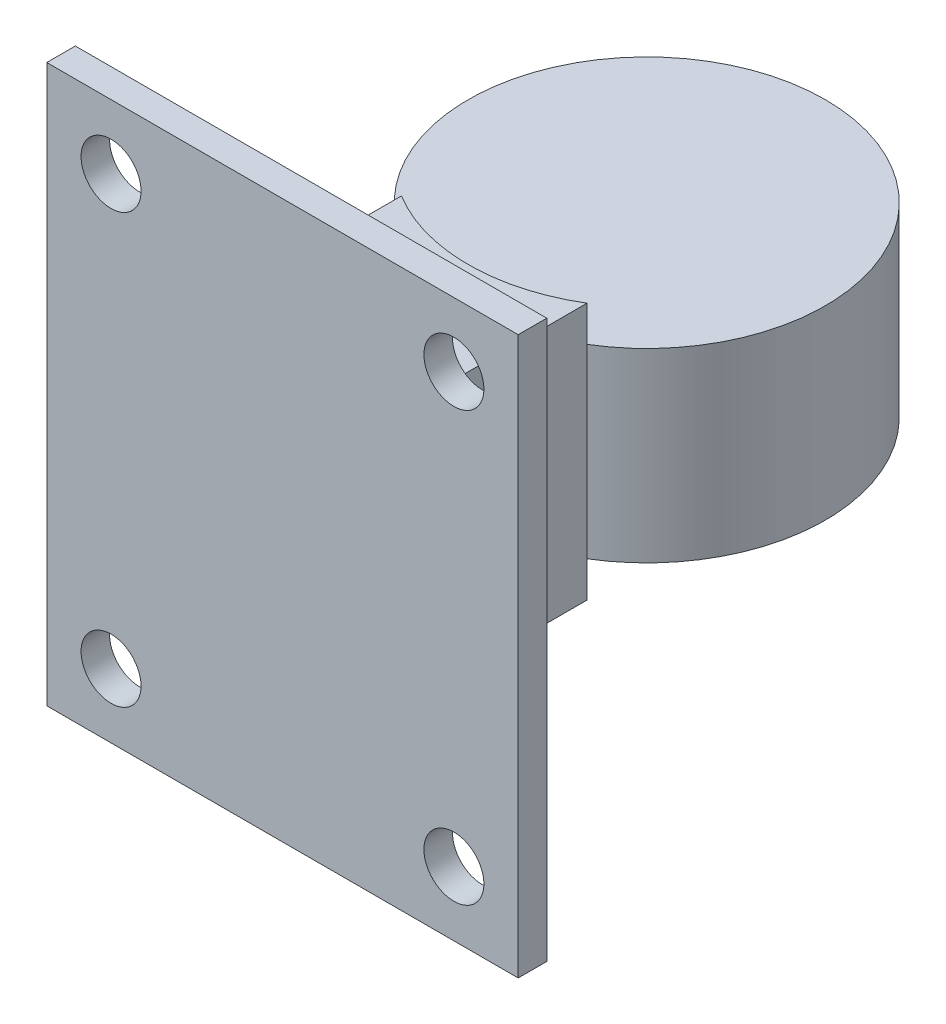
ISO-10303-21;
HEADER;
FILE_DESCRIPTION(('STEP AP214'),'2;1');
FILE_NAME('part.step','',(''),(''),'','','');
FILE_SCHEMA(('AUTOMOTIVE_DESIGN { 1 0 10303 214 1 1 1 1 }'));
ENDSEC;
DATA;
#1=APPLICATION_CONTEXT('core data for automotive mechanical design processes');
#2=APPLICATION_PROTOCOL_DEFINITION('international standard','automotive_design',2000,#1);
#3=PRODUCT_CONTEXT('',#1,'mechanical');
#4=PRODUCT('Part','Part','',(#3));
#5=PRODUCT_RELATED_PRODUCT_CATEGORY('part','',(#4));
#6=PRODUCT_DEFINITION_FORMATION('','',#4);
#7=PRODUCT_DEFINITION_CONTEXT('part definition',#1,'design');
#8=PRODUCT_DEFINITION('design','',#6,#7);
#9=PRODUCT_DEFINITION_SHAPE('','',#8);
#10=(LENGTH_UNIT() NAMED_UNIT(*) SI_UNIT(.MILLI.,.METRE.));
#11=(NAMED_UNIT(*) PLANE_ANGLE_UNIT() SI_UNIT($,.RADIAN.));
#12=(NAMED_UNIT(*) SI_UNIT($,.STERADIAN.) SOLID_ANGLE_UNIT());
#13=UNCERTAINTY_MEASURE_WITH_UNIT(LENGTH_MEASURE(1.E-05),#10,'distance_accuracy_value','');
#14=(GEOMETRIC_REPRESENTATION_CONTEXT(3) GLOBAL_UNCERTAINTY_ASSIGNED_CONTEXT((#13)) GLOBAL_UNIT_ASSIGNED_CONTEXT((#10,
#11,#12)) REPRESENTATION_CONTEXT('',''));
#15=CARTESIAN_POINT('',(0.,0.,0.));
#16=DIRECTION('',(0.,0.,1.));
#17=DIRECTION('',(1.,0.,0.));
#18=AXIS2_PLACEMENT_3D('',#15,#16,#17);
#19=CARTESIAN_POINT('',(16.5,6.5,12.5));
#20=DIRECTION('',(0.,1.,0.));
#21=DIRECTION('',(1.,0.,0.));
#22=AXIS2_PLACEMENT_3D('',#19,#20,#21);
#23=PLANE('',#22);
#24=CARTESIAN_POINT('',(16.5,6.5,12.5));
#25=DIRECTION('',(0.,1.,0.));
#26=DIRECTION('',(1.,0.,0.));
#27=AXIS2_PLACEMENT_3D('',#24,#25,#26);
#28=CIRCLE('',#27,12.5);
#29=CARTESIAN_POINT('',(22.9999998509884,6.5,23.1770783427467));
#30=VERTEX_POINT('',#29);
#31=CARTESIAN_POINT('',(10.0000001490116,6.5,23.1770783427467));
#32=VERTEX_POINT('',#31);
#33=EDGE_CURVE('P0_E11',#30,#32,#28,.T.);
#34=ORIENTED_EDGE('',*,*,#33,.T.);
#35=CARTESIAN_POINT('',(16.5,6.5,12.5));
#36=DIRECTION('',(0.,1.,0.));
#37=DIRECTION('',(1.,0.,0.));
#38=AXIS2_PLACEMENT_3D('',#35,#36,#37);
#39=CIRCLE('',#38,12.5);
#40=EDGE_CURVE('P0_E131',#32,#30,#39,.T.);
#41=ORIENTED_EDGE('',*,*,#40,.T.);
#42=EDGE_LOOP('',(#34,#41));
#43=FACE_BOUND('',#42,.T.);
#44=ADVANCED_FACE('P0_F17',(#43),#23,.T.);
#45=CARTESIAN_POINT('',(16.5,-6.5,12.5));
#46=DIRECTION('',(0.,1.,0.));
#47=DIRECTION('',(1.,0.,0.));
#48=AXIS2_PLACEMENT_3D('',#45,#46,#47);
#49=PLANE('',#48);
#50=CARTESIAN_POINT('',(16.5,-6.5,12.5));
#51=DIRECTION('',(0.,-1.,0.));
#52=DIRECTION('',(1.,0.,0.));
#53=AXIS2_PLACEMENT_3D('',#50,#51,#52);
#54=CIRCLE('',#53,12.5);
#55=CARTESIAN_POINT('',(10.0000001490116,-6.5,23.1770783427467));
#56=VERTEX_POINT('',#55);
#57=CARTESIAN_POINT('',(22.9999998509884,-6.5,23.1770783427467));
#58=VERTEX_POINT('',#57);
#59=EDGE_CURVE('P0_E25',#56,#58,#54,.T.);
#60=ORIENTED_EDGE('',*,*,#59,.T.);
#61=CARTESIAN_POINT('',(16.5,-6.5,12.5));
#62=DIRECTION('',(0.,-1.,0.));
#63=DIRECTION('',(1.,0.,0.));
#64=AXIS2_PLACEMENT_3D('',#61,#62,#63);
#65=CIRCLE('',#64,12.5);
#66=EDGE_CURVE('P0_E94',#58,#56,#65,.T.);
#67=ORIENTED_EDGE('',*,*,#66,.T.);
#68=EDGE_LOOP('',(#60,#67));
#69=FACE_BOUND('',#68,.T.);
#70=ADVANCED_FACE('P0_F92',(#69),#49,.F.);
#71=CARTESIAN_POINT('',(16.5,0.,12.5));
#72=DIRECTION('',(0.,1.,0.));
#73=DIRECTION('',(0.,0.,-1.));
#74=AXIS2_PLACEMENT_3D('',#71,#72,#73);
#75=CYLINDRICAL_SURFACE('',#74,12.5);
#76=DIRECTION('',(0.,-1.,0.));
#77=VECTOR('',#76,1.);
#78=CARTESIAN_POINT('',(22.9999998509884,0.,23.1770783427467));
#79=LINE('',#78,#77);
#80=EDGE_CURVE('P0_E100',#30,#58,#79,.T.);
#81=ORIENTED_EDGE('',*,*,#80,.T.);
#82=ORIENTED_EDGE('',*,*,#59,.F.);
#83=DIRECTION('',(0.,1.,0.));
#84=VECTOR('',#83,1.);
#85=CARTESIAN_POINT('',(10.0000001490116,0.,23.1770783427467));
#86=LINE('',#85,#84);
#87=EDGE_CURVE('P0_E105',#56,#32,#86,.T.);
#88=ORIENTED_EDGE('',*,*,#87,.T.);
#89=ORIENTED_EDGE('',*,*,#33,.F.);
#90=EDGE_LOOP('',(#81,#82,#88,#89));
#91=FACE_BOUND('',#90,.T.);
#92=ADVANCED_FACE('P0_F102',(#91),#75,.T.);
#93=CARTESIAN_POINT('',(16.5,9.,29.5885394395943));
#94=DIRECTION('',(0.,1.,0.));
#95=DIRECTION('',(1.,0.,0.));
#96=AXIS2_PLACEMENT_3D('',#93,#94,#95);
#97=PLANE('',#96);
#98=DIRECTION('',(1.,0.,0.));
#99=VECTOR('',#98,1.);
#100=CARTESIAN_POINT('',(0.,9.,36.0000005364418));
#101=LINE('',#100,#99);
#102=CARTESIAN_POINT('',(10.0000001490116,9.,36.0000005364418));
#103=VERTEX_POINT('',#102);
#104=CARTESIAN_POINT('',(22.9999998509884,9.,36.0000005364418));
#105=VERTEX_POINT('',#104);
#106=EDGE_CURVE('P0_E37',#103,#105,#101,.T.);
#107=ORIENTED_EDGE('',*,*,#106,.T.);
#108=DIRECTION('',(0.,0.,-1.));
#109=VECTOR('',#108,1.);
#110=CARTESIAN_POINT('',(22.9999998509884,9.,23.1770783427467));
#111=LINE('',#110,#109);
#112=CARTESIAN_POINT('',(22.9999998509884,9.,23.1770783427467));
#113=VERTEX_POINT('',#112);
#114=EDGE_CURVE('P0_E67',#105,#113,#111,.T.);
#115=ORIENTED_EDGE('',*,*,#114,.T.);
#116=CARTESIAN_POINT('',(16.5,9.,12.5));
#117=DIRECTION('',(0.,-1.,0.));
#118=DIRECTION('',(1.,0.,0.));
#119=AXIS2_PLACEMENT_3D('',#116,#117,#118);
#120=CIRCLE('',#119,12.5);
#121=CARTESIAN_POINT('',(10.0000001490116,9.,23.1770783427467));
#122=VERTEX_POINT('',#121);
#123=EDGE_CURVE('P0_E151',#113,#122,#120,.T.);
#124=ORIENTED_EDGE('',*,*,#123,.T.);
#125=DIRECTION('',(0.,0.,1.));
#126=VECTOR('',#125,1.);
#127=CARTESIAN_POINT('',(10.0000001490116,9.,36.0000005364418));
#128=LINE('',#127,#126);
#129=EDGE_CURVE('P0_E134',#122,#103,#128,.T.);
#130=ORIENTED_EDGE('',*,*,#129,.T.);
#131=EDGE_LOOP('',(#107,#115,#124,#130));
#132=FACE_BOUND('',#131,.T.);
#133=ADVANCED_FACE('P0_F209',(#132),#97,.T.);
#134=CARTESIAN_POINT('',(10.0000001490116,0.,36.0000005364418));
#135=DIRECTION('',(0.,0.,1.));
#136=DIRECTION('',(1.,0.,0.));
#137=AXIS2_PLACEMENT_3D('',#134,#135,#136);
#138=PLANE('',#137);
#139=DIRECTION('',(0.,1.,0.));
#140=VECTOR('',#139,1.);
#141=CARTESIAN_POINT('',(22.9999998509884,0.,36.0000005364418));
#142=LINE('',#141,#140);
#143=CARTESIAN_POINT('',(22.9999998509884,-9.,36.0000005364418));
#144=VERTEX_POINT('',#143);
#145=EDGE_CURVE('P0_E75',#144,#105,#142,.T.);
#146=ORIENTED_EDGE('',*,*,#145,.T.);
#147=ORIENTED_EDGE('',*,*,#106,.F.);
#148=DIRECTION('',(0.,-1.,0.));
#149=VECTOR('',#148,1.);
#150=CARTESIAN_POINT('',(10.0000001490116,0.,36.0000005364418));
#151=LINE('',#150,#149);
#152=CARTESIAN_POINT('',(10.0000001490116,-9.,36.0000005364418));
#153=VERTEX_POINT('',#152);
#154=EDGE_CURVE('P0_E159',#103,#153,#151,.T.);
#155=ORIENTED_EDGE('',*,*,#154,.T.);
#156=DIRECTION('',(-1.,0.,0.));
#157=VECTOR('',#156,1.);
#158=CARTESIAN_POINT('',(0.,-9.,36.0000005364418));
#159=LINE('',#158,#157);
#160=EDGE_CURVE('P0_E139',#144,#153,#159,.T.);
#161=ORIENTED_EDGE('',*,*,#160,.F.);
#162=EDGE_LOOP('',(#146,#147,#155,#161));
#163=FACE_BOUND('',#162,.T.);
#164=ADVANCED_FACE('P0_F214',(#163),#138,.T.);
#165=CARTESIAN_POINT('',(22.9999998509884,0.,36.0000005364418));
#166=DIRECTION('',(1.,0.,0.));
#167=DIRECTION('',(0.,1.,0.));
#168=AXIS2_PLACEMENT_3D('',#165,#166,#167);
#169=PLANE('',#168);
#170=DIRECTION('',(0.,1.,0.));
#171=VECTOR('',#170,1.);
#172=CARTESIAN_POINT('',(22.9999998509884,0.,23.1770783427467));
#173=LINE('',#172,#171);
#174=CARTESIAN_POINT('',(22.9999998509884,-9.,23.1770783427467));
#175=VERTEX_POINT('',#174);
#176=EDGE_CURVE('P0_E108',#175,#58,#173,.T.);
#177=ORIENTED_EDGE('',*,*,#176,.T.);
#178=ORIENTED_EDGE('',*,*,#80,.F.);
#179=DIRECTION('',(0.,1.,0.));
#180=VECTOR('',#179,1.);
#181=CARTESIAN_POINT('',(22.9999998509884,0.,23.1770783427467));
#182=LINE('',#181,#180);
#183=EDGE_CURVE('P0_E143',#30,#113,#182,.T.);
#184=ORIENTED_EDGE('',*,*,#183,.T.);
#185=ORIENTED_EDGE('',*,*,#114,.F.);
#186=ORIENTED_EDGE('',*,*,#145,.F.);
#187=DIRECTION('',(0.,0.,1.));
#188=VECTOR('',#187,1.);
#189=CARTESIAN_POINT('',(22.9999998509884,-9.,23.1770783427467));
#190=LINE('',#189,#188);
#191=EDGE_CURVE('P0_E110',#175,#144,#190,.T.);
#192=ORIENTED_EDGE('',*,*,#191,.F.);
#193=EDGE_LOOP('',(#177,#178,#184,#185,#186,#192));
#194=FACE_BOUND('',#193,.T.);
#195=ADVANCED_FACE('P0_F109',(#194),#169,.T.);
#196=CARTESIAN_POINT('',(10.0000001490116,0.,23.1770783427467));
#197=DIRECTION('',(-1.,0.,0.));
#198=DIRECTION('',(0.,0.,1.));
#199=AXIS2_PLACEMENT_3D('',#196,#197,#198);
#200=PLANE('',#199);
#201=ORIENTED_EDGE('',*,*,#154,.F.);
#202=ORIENTED_EDGE('',*,*,#129,.F.);
#203=DIRECTION('',(0.,1.,0.));
#204=VECTOR('',#203,1.);
#205=CARTESIAN_POINT('',(10.0000001490116,0.,23.1770783427467));
#206=LINE('',#205,#204);
#207=EDGE_CURVE('P0_E146',#32,#122,#206,.T.);
#208=ORIENTED_EDGE('',*,*,#207,.F.);
#209=ORIENTED_EDGE('',*,*,#87,.F.);
#210=DIRECTION('',(0.,1.,0.));
#211=VECTOR('',#210,1.);
#212=CARTESIAN_POINT('',(10.0000001490116,0.,23.1770783427467));
#213=LINE('',#212,#211);
#214=CARTESIAN_POINT('',(10.0000001490116,-9.,23.1770783427467));
#215=VERTEX_POINT('',#214);
#216=EDGE_CURVE('P0_E120',#215,#56,#213,.T.);
#217=ORIENTED_EDGE('',*,*,#216,.F.);
#218=DIRECTION('',(0.,0.,-1.));
#219=VECTOR('',#218,1.);
#220=CARTESIAN_POINT('',(10.0000001490116,-9.,36.0000005364418));
#221=LINE('',#220,#219);
#222=EDGE_CURVE('P0_E135',#153,#215,#221,.T.);
#223=ORIENTED_EDGE('',*,*,#222,.F.);
#224=EDGE_LOOP('',(#201,#202,#208,#209,#217,#223));
#225=FACE_BOUND('',#224,.T.);
#226=ADVANCED_FACE('P0_F231',(#225),#200,.T.);
#227=CARTESIAN_POINT('',(16.5,-9.,29.5885394395943));
#228=DIRECTION('',(0.,1.,0.));
#229=DIRECTION('',(1.,0.,0.));
#230=AXIS2_PLACEMENT_3D('',#227,#228,#229);
#231=PLANE('',#230);
#232=ORIENTED_EDGE('',*,*,#160,.T.);
#233=ORIENTED_EDGE('',*,*,#222,.T.);
#234=CARTESIAN_POINT('',(16.5,-9.,12.5));
#235=DIRECTION('',(0.,1.,0.));
#236=DIRECTION('',(1.,0.,0.));
#237=AXIS2_PLACEMENT_3D('',#234,#235,#236);
#238=CIRCLE('',#237,12.5);
#239=EDGE_CURVE('P0_E115',#215,#175,#238,.T.);
#240=ORIENTED_EDGE('',*,*,#239,.T.);
#241=ORIENTED_EDGE('',*,*,#191,.T.);
#242=EDGE_LOOP('',(#232,#233,#240,#241));
#243=FACE_BOUND('',#242,.T.);
#244=ADVANCED_FACE('P0_F239',(#243),#231,.F.);
#245=CARTESIAN_POINT('',(16.5,0.,12.5));
#246=DIRECTION('',(0.,1.,0.));
#247=DIRECTION('',(1.,0.,0.));
#248=AXIS2_PLACEMENT_3D('',#245,#246,#247);
#249=CYLINDRICAL_SURFACE('',#248,12.5);
#250=ORIENTED_EDGE('',*,*,#40,.F.);
#251=ORIENTED_EDGE('',*,*,#207,.T.);
#252=ORIENTED_EDGE('',*,*,#123,.F.);
#253=ORIENTED_EDGE('',*,*,#183,.F.);
#254=EDGE_LOOP('',(#250,#251,#252,#253));
#255=FACE_BOUND('',#254,.T.);
#256=ADVANCED_FACE('P0_F223',(#255),#249,.F.);
#257=CARTESIAN_POINT('',(16.5,0.,12.5));
#258=DIRECTION('',(0.,1.,0.));
#259=DIRECTION('',(1.,0.,0.));
#260=AXIS2_PLACEMENT_3D('',#257,#258,#259);
#261=CYLINDRICAL_SURFACE('',#260,12.5);
#262=ORIENTED_EDGE('',*,*,#66,.F.);
#263=ORIENTED_EDGE('',*,*,#176,.F.);
#264=ORIENTED_EDGE('',*,*,#239,.F.);
#265=ORIENTED_EDGE('',*,*,#216,.T.);
#266=EDGE_LOOP('',(#262,#263,#264,#265));
#267=FACE_BOUND('',#266,.T.);
#268=ADVANCED_FACE('P0_F118',(#267),#261,.F.);
#269=CLOSED_SHELL('',(#44,#70,#92,#133,#164,#195,#226,#244,#256,#268));
#270=MANIFOLD_SOLID_BREP('P0_B1',#269);
#271=CARTESIAN_POINT('',(16.5000002458692,19.5,37.000000551343));
#272=DIRECTION('',(0.,1.,0.));
#273=DIRECTION('',(1.,0.,0.));
#274=AXIS2_PLACEMENT_3D('',#271,#272,#273);
#275=PLANE('',#274);
#276=DIRECTION('',(1.,0.,0.));
#277=VECTOR('',#276,1.);
#278=CARTESIAN_POINT('',(0.,19.5,38.0000005662441));
#279=LINE('',#278,#277);
#280=CARTESIAN_POINT('',(0.,19.5,38.0000005662441));
#281=VERTEX_POINT('',#280);
#282=CARTESIAN_POINT('',(33.,19.5,38.0000005662441));
#283=VERTEX_POINT('',#282);
#284=EDGE_CURVE('P1_E11',#281,#283,#279,.T.);
#285=ORIENTED_EDGE('',*,*,#284,.T.);
#286=DIRECTION('',(0.,0.,-1.));
#287=VECTOR('',#286,1.);
#288=CARTESIAN_POINT('',(33.,19.5,38.0000005662441));
#289=LINE('',#288,#287);
#290=CARTESIAN_POINT('',(33.0000004917383,19.5,36.0000005364418));
#291=VERTEX_POINT('',#290);
#292=EDGE_CURVE('P1_E43',#283,#291,#289,.T.);
#293=ORIENTED_EDGE('',*,*,#292,.T.);
#294=DIRECTION('',(-1.,0.,0.));
#295=VECTOR('',#294,1.);
#296=CARTESIAN_POINT('',(0.,19.5,36.0000005364418));
#297=LINE('',#296,#295);
#298=CARTESIAN_POINT('',(0.,19.5,36.0000005364418));
#299=VERTEX_POINT('',#298);
#300=EDGE_CURVE('P1_E166',#291,#299,#297,.T.);
#301=ORIENTED_EDGE('',*,*,#300,.T.);
#302=DIRECTION('',(0.,0.,1.));
#303=VECTOR('',#302,1.);
#304=CARTESIAN_POINT('',(0.,19.5,0.));
#305=LINE('',#304,#303);
#306=EDGE_CURVE('P1_E160',#299,#281,#305,.T.);
#307=ORIENTED_EDGE('',*,*,#306,.T.);
#308=EDGE_LOOP('',(#285,#293,#301,#307));
#309=FACE_BOUND('',#308,.T.);
#310=ADVANCED_FACE('P1_F17',(#309),#275,.T.);
#311=CARTESIAN_POINT('',(0.,0.,38.0000005662441));
#312=DIRECTION('',(0.,0.,1.));
#313=DIRECTION('',(1.,0.,0.));
#314=AXIS2_PLACEMENT_3D('',#311,#312,#313);
#315=PLANE('',#314);
#316=CARTESIAN_POINT('',(4.5,-15.,38.0000005662441));
#317=DIRECTION('',(0.,0.,-1.));
#318=DIRECTION('',(-1.,0.,0.));
#319=AXIS2_PLACEMENT_3D('',#316,#317,#318);
#320=CIRCLE('',#319,2.1);
#321=CARTESIAN_POINT('',(6.6,-15.,38.0000005662441));
#322=VERTEX_POINT('',#321);
#323=EDGE_CURVE('P1_E146',#322,#322,#320,.T.);
#324=ORIENTED_EDGE('',*,*,#323,.T.);
#325=EDGE_LOOP('',(#324));
#326=FACE_BOUND('',#325,.T.);
#327=CARTESIAN_POINT('',(4.5,15.,38.0000005662441));
#328=DIRECTION('',(0.,0.,-1.));
#329=DIRECTION('',(-1.,0.,0.));
#330=AXIS2_PLACEMENT_3D('',#327,#328,#329);
#331=CIRCLE('',#330,2.1);
#332=CARTESIAN_POINT('',(6.6,15.,38.0000005662441));
#333=VERTEX_POINT('',#332);
#334=EDGE_CURVE('P1_E129',#333,#333,#331,.T.);
#335=ORIENTED_EDGE('',*,*,#334,.T.);
#336=EDGE_LOOP('',(#335));
#337=FACE_BOUND('',#336,.T.);
#338=CARTESIAN_POINT('',(28.5,-15.,38.0000005662441));
#339=DIRECTION('',(0.,0.,-1.));
#340=DIRECTION('',(-1.,0.,0.));
#341=AXIS2_PLACEMENT_3D('',#338,#339,#340);
#342=CIRCLE('',#341,2.1);
#343=CARTESIAN_POINT('',(30.6,-15.,38.0000005662441));
#344=VERTEX_POINT('',#343);
#345=EDGE_CURVE('P1_E107',#344,#344,#342,.T.);
#346=ORIENTED_EDGE('',*,*,#345,.T.);
#347=EDGE_LOOP('',(#346));
#348=FACE_BOUND('',#347,.T.);
#349=CARTESIAN_POINT('',(28.5,15.,38.0000005662441));
#350=DIRECTION('',(0.,0.,-1.));
#351=DIRECTION('',(-1.,0.,0.));
#352=AXIS2_PLACEMENT_3D('',#349,#350,#351);
#353=CIRCLE('',#352,2.1);
#354=CARTESIAN_POINT('',(30.6,15.,38.0000005662441));
#355=VERTEX_POINT('',#354);
#356=EDGE_CURVE('P1_E119',#355,#355,#353,.T.);
#357=ORIENTED_EDGE('',*,*,#356,.T.);
#358=EDGE_LOOP('',(#357));
#359=FACE_BOUND('',#358,.T.);
#360=DIRECTION('',(0.,1.,0.));
#361=VECTOR('',#360,1.);
#362=CARTESIAN_POINT('',(33.,0.,38.0000005662441));
#363=LINE('',#362,#361);
#364=CARTESIAN_POINT('',(33.,-19.5,38.0000005662441));
#365=VERTEX_POINT('',#364);
#366=EDGE_CURVE('P1_E26',#365,#283,#363,.T.);
#367=ORIENTED_EDGE('',*,*,#366,.T.);
#368=ORIENTED_EDGE('',*,*,#284,.F.);
#369=DIRECTION('',(0.,-1.,0.));
#370=VECTOR('',#369,1.);
#371=CARTESIAN_POINT('',(0.,0.,38.0000005662441));
#372=LINE('',#371,#370);
#373=CARTESIAN_POINT('',(0.,-19.5,38.0000005662441));
#374=VERTEX_POINT('',#373);
#375=EDGE_CURVE('P1_E157',#281,#374,#372,.T.);
#376=ORIENTED_EDGE('',*,*,#375,.T.);
#377=DIRECTION('',(-1.,0.,0.));
#378=VECTOR('',#377,1.);
#379=CARTESIAN_POINT('',(0.,-19.5,38.0000005662441));
#380=LINE('',#379,#378);
#381=EDGE_CURVE('P1_E133',#365,#374,#380,.T.);
#382=ORIENTED_EDGE('',*,*,#381,.F.);
#383=EDGE_LOOP('',(#367,#368,#376,#382));
#384=FACE_BOUND('',#383,.T.);
#385=ADVANCED_FACE('P1_F19',(#326,#337,#348,#359,#384),#315,.T.);
#386=CARTESIAN_POINT('',(33.,0.,38.0000005662441));
#387=DIRECTION('',(1.,0.,0.));
#388=DIRECTION('',(0.,1.,0.));
#389=AXIS2_PLACEMENT_3D('',#386,#387,#388);
#390=PLANE('',#389);
#391=DIRECTION('',(0.,1.,0.));
#392=VECTOR('',#391,1.);
#393=CARTESIAN_POINT('',(33.0000004917383,0.,36.0000005364418));
#394=LINE('',#393,#392);
#395=CARTESIAN_POINT('',(33.0000004917383,-19.5,36.0000005364418));
#396=VERTEX_POINT('',#395);
#397=EDGE_CURVE('P1_E168',#396,#291,#394,.T.);
#398=ORIENTED_EDGE('',*,*,#397,.T.);
#399=ORIENTED_EDGE('',*,*,#292,.F.);
#400=ORIENTED_EDGE('',*,*,#366,.F.);
#401=DIRECTION('',(0.,0.,1.));
#402=VECTOR('',#401,1.);
#403=CARTESIAN_POINT('',(33.,-19.5,38.0000005662441));
#404=LINE('',#403,#402);
#405=EDGE_CURVE('P1_E153',#396,#365,#404,.T.);
#406=ORIENTED_EDGE('',*,*,#405,.F.);
#407=EDGE_LOOP('',(#398,#399,#400,#406));
#408=FACE_BOUND('',#407,.T.);
#409=ADVANCED_FACE('P1_F244',(#408),#390,.T.);
#410=CARTESIAN_POINT('',(33.0000004917383,0.,36.0000005364418));
#411=DIRECTION('',(0.,0.,-1.));
#412=DIRECTION('',(0.,-1.,0.));
#413=AXIS2_PLACEMENT_3D('',#410,#411,#412);
#414=PLANE('',#413);
#415=CARTESIAN_POINT('',(4.5,-15.,36.0000005364418));
#416=DIRECTION('',(0.,0.,1.));
#417=DIRECTION('',(-1.,0.,0.));
#418=AXIS2_PLACEMENT_3D('',#415,#416,#417);
#419=CIRCLE('',#418,2.1);
#420=CARTESIAN_POINT('',(6.6,-15.,36.0000005364418));
#421=VERTEX_POINT('',#420);
#422=EDGE_CURVE('P1_E130',#421,#421,#419,.T.);
#423=ORIENTED_EDGE('',*,*,#422,.T.);
#424=EDGE_LOOP('',(#423));
#425=FACE_BOUND('',#424,.T.);
#426=CARTESIAN_POINT('',(4.5,15.,36.0000005364418));
#427=DIRECTION('',(0.,0.,1.));
#428=DIRECTION('',(-1.,0.,0.));
#429=AXIS2_PLACEMENT_3D('',#426,#427,#428);
#430=CIRCLE('',#429,2.1);
#431=CARTESIAN_POINT('',(6.6,15.,36.0000005364418));
#432=VERTEX_POINT('',#431);
#433=EDGE_CURVE('P1_E139',#432,#432,#430,.T.);
#434=ORIENTED_EDGE('',*,*,#433,.T.);
#435=EDGE_LOOP('',(#434));
#436=FACE_BOUND('',#435,.T.);
#437=CARTESIAN_POINT('',(28.5,-15.,36.0000005364418));
#438=DIRECTION('',(0.,0.,1.));
#439=DIRECTION('',(-1.,0.,0.));
#440=AXIS2_PLACEMENT_3D('',#437,#438,#439);
#441=CIRCLE('',#440,2.1);
#442=CARTESIAN_POINT('',(30.6,-15.,36.0000005364418));
#443=VERTEX_POINT('',#442);
#444=EDGE_CURVE('P1_E125',#443,#443,#441,.T.);
#445=ORIENTED_EDGE('',*,*,#444,.T.);
#446=EDGE_LOOP('',(#445));
#447=FACE_BOUND('',#446,.T.);
#448=CARTESIAN_POINT('',(28.5,15.,36.0000005364418));
#449=DIRECTION('',(0.,0.,1.));
#450=DIRECTION('',(-1.,0.,0.));
#451=AXIS2_PLACEMENT_3D('',#448,#449,#450);
#452=CIRCLE('',#451,2.1);
#453=CARTESIAN_POINT('',(30.6,15.,36.0000005364418));
#454=VERTEX_POINT('',#453);
#455=EDGE_CURVE('P1_E101',#454,#454,#452,.T.);
#456=ORIENTED_EDGE('',*,*,#455,.T.);
#457=EDGE_LOOP('',(#456));
#458=FACE_BOUND('',#457,.T.);
#459=DIRECTION('',(0.,1.,0.));
#460=VECTOR('',#459,1.);
#461=CARTESIAN_POINT('',(0.,0.,36.0000005364418));
#462=LINE('',#461,#460);
#463=CARTESIAN_POINT('',(0.,-19.5,36.0000005364418));
#464=VERTEX_POINT('',#463);
#465=EDGE_CURVE('P1_E163',#464,#299,#462,.T.);
#466=ORIENTED_EDGE('',*,*,#465,.T.);
#467=ORIENTED_EDGE('',*,*,#300,.F.);
#468=ORIENTED_EDGE('',*,*,#397,.F.);
#469=DIRECTION('',(1.,0.,0.));
#470=VECTOR('',#469,1.);
#471=CARTESIAN_POINT('',(0.,-19.5,36.0000005364418));
#472=LINE('',#471,#470);
#473=EDGE_CURVE('P1_E143',#464,#396,#472,.T.);
#474=ORIENTED_EDGE('',*,*,#473,.F.);
#475=EDGE_LOOP('',(#466,#467,#468,#474));
#476=FACE_BOUND('',#475,.T.);
#477=ADVANCED_FACE('P1_F102',(#425,#436,#447,#458,#476),#414,.T.);
#478=CARTESIAN_POINT('',(0.,0.,36.0000005364418));
#479=DIRECTION('',(-1.,0.,0.));
#480=DIRECTION('',(0.,0.,1.));
#481=AXIS2_PLACEMENT_3D('',#478,#479,#480);
#482=PLANE('',#481);
#483=ORIENTED_EDGE('',*,*,#375,.F.);
#484=ORIENTED_EDGE('',*,*,#306,.F.);
#485=ORIENTED_EDGE('',*,*,#465,.F.);
#486=DIRECTION('',(0.,0.,-1.));
#487=VECTOR('',#486,1.);
#488=CARTESIAN_POINT('',(0.,-19.5,0.));
#489=LINE('',#488,#487);
#490=EDGE_CURVE('P1_E140',#374,#464,#489,.T.);
#491=ORIENTED_EDGE('',*,*,#490,.F.);
#492=EDGE_LOOP('',(#483,#484,#485,#491));
#493=FACE_BOUND('',#492,.T.);
#494=ADVANCED_FACE('P1_F243',(#493),#482,.T.);
#495=CARTESIAN_POINT('',(16.5000002458692,-19.5,37.000000551343));
#496=DIRECTION('',(0.,-1.,0.));
#497=DIRECTION('',(0.,0.,-1.));
#498=AXIS2_PLACEMENT_3D('',#495,#496,#497);
#499=PLANE('',#498);
#500=ORIENTED_EDGE('',*,*,#381,.T.);
#501=ORIENTED_EDGE('',*,*,#490,.T.);
#502=ORIENTED_EDGE('',*,*,#473,.T.);
#503=ORIENTED_EDGE('',*,*,#405,.T.);
#504=EDGE_LOOP('',(#500,#501,#502,#503));
#505=FACE_BOUND('',#504,.T.);
#506=ADVANCED_FACE('P1_F265',(#505),#499,.T.);
#507=CARTESIAN_POINT('',(4.5,-15.,38.0000005662441));
#508=DIRECTION('',(0.,0.,-1.));
#509=DIRECTION('',(-1.,0.,0.));
#510=AXIS2_PLACEMENT_3D('',#507,#508,#509);
#511=CYLINDRICAL_SURFACE('',#510,2.1);
#512=ORIENTED_EDGE('',*,*,#323,.F.);
#513=DIRECTION('',(0.,0.,-1.));
#514=VECTOR('',#513,1.);
#515=CARTESIAN_POINT('',(6.6,-15.,38.0000005662441));
#516=LINE('',#515,#514);
#517=EDGE_CURVE('P1_E134',#322,#421,#516,.T.);
#518=ORIENTED_EDGE('',*,*,#517,.T.);
#519=ORIENTED_EDGE('',*,*,#422,.F.);
#520=ORIENTED_EDGE('',*,*,#517,.F.);
#521=EDGE_LOOP('',(#512,#518,#519,#520));
#522=FACE_BOUND('',#521,.T.);
#523=ADVANCED_FACE('P1_F267',(#522),#511,.F.);
#524=CARTESIAN_POINT('',(4.5,15.,38.0000005662441));
#525=DIRECTION('',(0.,0.,-1.));
#526=DIRECTION('',(-1.,0.,0.));
#527=AXIS2_PLACEMENT_3D('',#524,#525,#526);
#528=CYLINDRICAL_SURFACE('',#527,2.1);
#529=ORIENTED_EDGE('',*,*,#334,.F.);
#530=DIRECTION('',(0.,0.,-1.));
#531=VECTOR('',#530,1.);
#532=CARTESIAN_POINT('',(6.6,15.,38.0000005662441));
#533=LINE('',#532,#531);
#534=EDGE_CURVE('P1_E135',#333,#432,#533,.T.);
#535=ORIENTED_EDGE('',*,*,#534,.T.);
#536=ORIENTED_EDGE('',*,*,#433,.F.);
#537=ORIENTED_EDGE('',*,*,#534,.F.);
#538=EDGE_LOOP('',(#529,#535,#536,#537));
#539=FACE_BOUND('',#538,.T.);
#540=ADVANCED_FACE('P1_F238',(#539),#528,.F.);
#541=CARTESIAN_POINT('',(28.5,-15.,38.0000005662441));
#542=DIRECTION('',(0.,0.,-1.));
#543=DIRECTION('',(-1.,0.,0.));
#544=AXIS2_PLACEMENT_3D('',#541,#542,#543);
#545=CYLINDRICAL_SURFACE('',#544,2.1);
#546=ORIENTED_EDGE('',*,*,#345,.F.);
#547=DIRECTION('',(0.,0.,-1.));
#548=VECTOR('',#547,1.);
#549=CARTESIAN_POINT('',(30.6,-15.,38.0000005662441));
#550=LINE('',#549,#548);
#551=EDGE_CURVE('P1_E116',#344,#443,#550,.T.);
#552=ORIENTED_EDGE('',*,*,#551,.T.);
#553=ORIENTED_EDGE('',*,*,#444,.F.);
#554=ORIENTED_EDGE('',*,*,#551,.F.);
#555=EDGE_LOOP('',(#546,#552,#553,#554));
#556=FACE_BOUND('',#555,.T.);
#557=ADVANCED_FACE('P1_F250',(#556),#545,.F.);
#558=CARTESIAN_POINT('',(28.5,15.,38.0000005662441));
#559=DIRECTION('',(0.,0.,-1.));
#560=DIRECTION('',(-1.,0.,0.));
#561=AXIS2_PLACEMENT_3D('',#558,#559,#560);
#562=CYLINDRICAL_SURFACE('',#561,2.1);
#563=ORIENTED_EDGE('',*,*,#356,.F.);
#564=DIRECTION('',(0.,0.,-1.));
#565=VECTOR('',#564,1.);
#566=CARTESIAN_POINT('',(30.6,15.,38.0000005662441));
#567=LINE('',#566,#565);
#568=EDGE_CURVE('P1_E108',#355,#454,#567,.T.);
#569=ORIENTED_EDGE('',*,*,#568,.T.);
#570=ORIENTED_EDGE('',*,*,#455,.F.);
#571=ORIENTED_EDGE('',*,*,#568,.F.);
#572=EDGE_LOOP('',(#563,#569,#570,#571));
#573=FACE_BOUND('',#572,.T.);
#574=ADVANCED_FACE('P1_F285',(#573),#562,.F.);
#575=CLOSED_SHELL('',(#310,#385,#409,#477,#494,#506,#523,#540,#557,#574));
#576=MANIFOLD_SOLID_BREP('P1_B1',#575);
#577=ADVANCED_BREP_SHAPE_REPRESENTATION('',(#18,#270,#576),#14);
#578=SHAPE_DEFINITION_REPRESENTATION(#9,#577);
ENDSEC;
END-ISO-10303-21;
